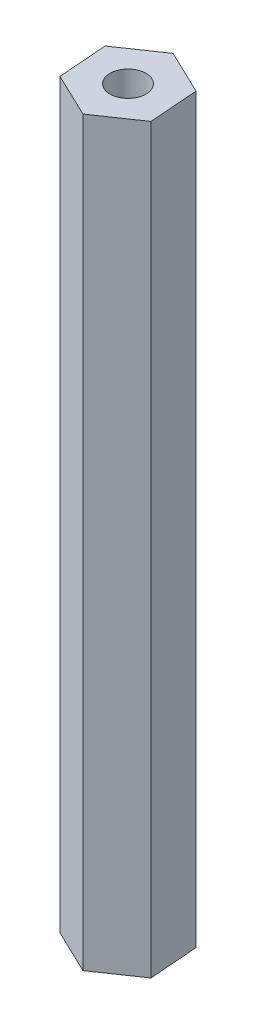
ISO-10303-21;
HEADER;
FILE_DESCRIPTION(('STEP AP214'),'2;1');
FILE_NAME('part.step','',(''),(''),'','','');
FILE_SCHEMA(('AUTOMOTIVE_DESIGN { 1 0 10303 214 1 1 1 1 }'));
ENDSEC;
DATA;
#1=APPLICATION_CONTEXT('core data for automotive mechanical design processes');
#2=APPLICATION_PROTOCOL_DEFINITION('international standard','automotive_design',2000,#1);
#3=PRODUCT_CONTEXT('',#1,'mechanical');
#4=PRODUCT('Part','Part','',(#3));
#5=PRODUCT_RELATED_PRODUCT_CATEGORY('part','',(#4));
#6=PRODUCT_DEFINITION_FORMATION('','',#4);
#7=PRODUCT_DEFINITION_CONTEXT('part definition',#1,'design');
#8=PRODUCT_DEFINITION('design','',#6,#7);
#9=PRODUCT_DEFINITION_SHAPE('','',#8);
#10=(LENGTH_UNIT() NAMED_UNIT(*) SI_UNIT(.MILLI.,.METRE.));
#11=(NAMED_UNIT(*) PLANE_ANGLE_UNIT() SI_UNIT($,.RADIAN.));
#12=(NAMED_UNIT(*) SI_UNIT($,.STERADIAN.) SOLID_ANGLE_UNIT());
#13=UNCERTAINTY_MEASURE_WITH_UNIT(LENGTH_MEASURE(1.E-05),#10,'distance_accuracy_value','');
#14=(GEOMETRIC_REPRESENTATION_CONTEXT(3) GLOBAL_UNCERTAINTY_ASSIGNED_CONTEXT((#13)) GLOBAL_UNIT_ASSIGNED_CONTEXT((#10,
#11,#12)) REPRESENTATION_CONTEXT('',''));
#15=CARTESIAN_POINT('',(0.,0.,0.));
#16=DIRECTION('',(0.,0.,1.));
#17=DIRECTION('',(1.,0.,0.));
#18=AXIS2_PLACEMENT_3D('',#15,#16,#17);
#19=CARTESIAN_POINT('',(4.1881559648035,-1.,-26.3053742712762));
#20=DIRECTION('',(-0.997076466113697,0.,0.0764102134679752));
#21=DIRECTION('',(-0.0764102134679752,0.,-0.997076466113697));
#22=AXIS2_PLACEMENT_3D('',#19,#20,#21);
#23=PLANE('',#22);
#24=DIRECTION('',(-0.0764102134679752,0.,-0.997076466113697));
#25=VECTOR('',#24,1.);
#26=CARTESIAN_POINT('',(4.1881559648035,-71.,-26.3053742712762));
#27=LINE('',#26,#25);
#28=CARTESIAN_POINT('',(4.1881559648035,-71.,-26.3053742712762));
#29=VERTEX_POINT('',#28);
#30=CARTESIAN_POINT('',(3.83523230628693,-71.,-30.9106732001833));
#31=VERTEX_POINT('',#30);
#32=EDGE_CURVE('E133',#29,#31,#27,.T.);
#33=ORIENTED_EDGE('',*,*,#32,.F.);
#34=DIRECTION('',(0.,-1.,0.));
#35=VECTOR('',#34,1.);
#36=CARTESIAN_POINT('',(4.1881559648035,-1.,-26.3053742712762));
#37=LINE('',#36,#35);
#38=CARTESIAN_POINT('',(4.1881559648035,-1.,-26.3053742712762));
#39=VERTEX_POINT('',#38);
#40=EDGE_CURVE('E11',#39,#29,#37,.T.);
#41=ORIENTED_EDGE('',*,*,#40,.F.);
#42=DIRECTION('',(-0.0764102134679752,0.,-0.997076466113697));
#43=VECTOR('',#42,1.);
#44=CARTESIAN_POINT('',(4.1881559648035,-1.,-26.3053742712762));
#45=LINE('',#44,#43);
#46=CARTESIAN_POINT('',(3.83523230628693,-1.,-30.9106732001833));
#47=VERTEX_POINT('',#46);
#48=EDGE_CURVE('E151',#39,#47,#45,.T.);
#49=ORIENTED_EDGE('',*,*,#48,.T.);
#50=DIRECTION('',(0.,-1.,0.));
#51=VECTOR('',#50,1.);
#52=CARTESIAN_POINT('',(3.83523230628693,-1.,-30.9106732001833));
#53=LINE('',#52,#51);
#54=EDGE_CURVE('E45',#47,#31,#53,.T.);
#55=ORIENTED_EDGE('',*,*,#54,.T.);
#56=EDGE_LOOP('',(#33,#41,#49,#55));
#57=FACE_BOUND('',#56,.T.);
#58=ADVANCED_FACE('F42',(#57),#23,.T.);
#59=CARTESIAN_POINT('',(8.35292365851658,-1.,-24.3083656606946));
#60=DIRECTION('',(-0.43236504708499,0.,0.901698655904063));
#61=DIRECTION('',(-0.901698655904063,0.,-0.43236504708499));
#62=AXIS2_PLACEMENT_3D('',#59,#60,#61);
#63=PLANE('',#62);
#64=DIRECTION('',(-0.901698655904063,0.,-0.43236504708499));
#65=VECTOR('',#64,1.);
#66=CARTESIAN_POINT('',(8.35292365851658,-71.,-24.3083656606946));
#67=LINE('',#66,#65);
#68=CARTESIAN_POINT('',(8.35292365851658,-71.,-24.3083656606946));
#69=VERTEX_POINT('',#68);
#70=EDGE_CURVE('E148',#69,#29,#67,.T.);
#71=ORIENTED_EDGE('',*,*,#70,.F.);
#72=DIRECTION('',(0.,-1.,0.));
#73=VECTOR('',#72,1.);
#74=CARTESIAN_POINT('',(8.35292365851658,-1.,-24.3083656606946));
#75=LINE('',#74,#73);
#76=CARTESIAN_POINT('',(8.35292365851658,-1.,-24.3083656606946));
#77=VERTEX_POINT('',#76);
#78=EDGE_CURVE('E51',#77,#69,#75,.T.);
#79=ORIENTED_EDGE('',*,*,#78,.F.);
#80=DIRECTION('',(-0.901698655904063,0.,-0.43236504708499));
#81=VECTOR('',#80,1.);
#82=CARTESIAN_POINT('',(8.35292365851658,-1.,-24.3083656606946));
#83=LINE('',#82,#81);
#84=EDGE_CURVE('E118',#77,#39,#83,.T.);
#85=ORIENTED_EDGE('',*,*,#84,.T.);
#86=ORIENTED_EDGE('',*,*,#40,.T.);
#87=EDGE_LOOP('',(#71,#79,#85,#86));
#88=FACE_BOUND('',#87,.T.);
#89=ADVANCED_FACE('F167',(#88),#63,.T.);
#90=CARTESIAN_POINT('',(12.1647676937131,-1.,-26.91665597902));
#91=DIRECTION('',(0.564711419028707,0.,0.825288442436088));
#92=DIRECTION('',(-0.825288442436088,0.,0.564711419028707));
#93=AXIS2_PLACEMENT_3D('',#90,#91,#92);
#94=PLANE('',#93);
#95=DIRECTION('',(-0.825288442436088,0.,0.564711419028707));
#96=VECTOR('',#95,1.);
#97=CARTESIAN_POINT('',(12.1647676937131,-71.,-26.91665597902));
#98=LINE('',#97,#96);
#99=CARTESIAN_POINT('',(12.1647676937131,-71.,-26.91665597902));
#100=VERTEX_POINT('',#99);
#101=EDGE_CURVE('E104',#100,#69,#98,.T.);
#102=ORIENTED_EDGE('',*,*,#101,.F.);
#103=DIRECTION('',(0.,-1.,0.));
#104=VECTOR('',#103,1.);
#105=CARTESIAN_POINT('',(12.1647676937131,-1.,-26.91665597902));
#106=LINE('',#105,#104);
#107=CARTESIAN_POINT('',(12.1647676937131,-1.,-26.91665597902));
#108=VERTEX_POINT('',#107);
#109=EDGE_CURVE('E99',#108,#100,#106,.T.);
#110=ORIENTED_EDGE('',*,*,#109,.F.);
#111=DIRECTION('',(-0.825288442436088,0.,0.564711419028707));
#112=VECTOR('',#111,1.);
#113=CARTESIAN_POINT('',(12.1647676937131,-1.,-26.91665597902));
#114=LINE('',#113,#112);
#115=EDGE_CURVE('E102',#108,#77,#114,.T.);
#116=ORIENTED_EDGE('',*,*,#115,.T.);
#117=ORIENTED_EDGE('',*,*,#78,.T.);
#118=EDGE_LOOP('',(#102,#110,#116,#117));
#119=FACE_BOUND('',#118,.T.);
#120=ADVANCED_FACE('F101',(#119),#94,.T.);
#121=CARTESIAN_POINT('',(11.8118440351965,-1.,-31.5219549079271));
#122=DIRECTION('',(0.997076466113697,0.,-0.0764102134679748));
#123=DIRECTION('',(0.0764102134679748,0.,0.997076466113697));
#124=AXIS2_PLACEMENT_3D('',#121,#122,#123);
#125=PLANE('',#124);
#126=DIRECTION('',(0.0764102134679747,0.,0.997076466113697));
#127=VECTOR('',#126,1.);
#128=CARTESIAN_POINT('',(11.8118440351965,-71.,-31.5219549079271));
#129=LINE('',#128,#127);
#130=CARTESIAN_POINT('',(11.8118440351965,-71.,-31.5219549079271));
#131=VERTEX_POINT('',#130);
#132=EDGE_CURVE('E144',#131,#100,#129,.T.);
#133=ORIENTED_EDGE('',*,*,#132,.F.);
#134=DIRECTION('',(0.,-1.,0.));
#135=VECTOR('',#134,1.);
#136=CARTESIAN_POINT('',(11.8118440351965,-1.,-31.5219549079271));
#137=LINE('',#136,#135);
#138=CARTESIAN_POINT('',(11.8118440351965,-1.,-31.5219549079271));
#139=VERTEX_POINT('',#138);
#140=EDGE_CURVE('E110',#139,#131,#137,.T.);
#141=ORIENTED_EDGE('',*,*,#140,.F.);
#142=DIRECTION('',(0.0764102134679747,0.,0.997076466113697));
#143=VECTOR('',#142,1.);
#144=CARTESIAN_POINT('',(11.8118440351965,-1.,-31.5219549079271));
#145=LINE('',#144,#143);
#146=EDGE_CURVE('E116',#139,#108,#145,.T.);
#147=ORIENTED_EDGE('',*,*,#146,.T.);
#148=ORIENTED_EDGE('',*,*,#109,.T.);
#149=EDGE_LOOP('',(#133,#141,#147,#148));
#150=FACE_BOUND('',#149,.T.);
#151=ADVANCED_FACE('F121',(#150),#125,.T.);
#152=CARTESIAN_POINT('',(7.64707634148343,-1.,-33.5189635185087));
#153=DIRECTION('',(0.43236504708499,0.,-0.901698655904063));
#154=DIRECTION('',(0.901698655904063,0.,0.43236504708499));
#155=AXIS2_PLACEMENT_3D('',#152,#153,#154);
#156=PLANE('',#155);
#157=DIRECTION('',(0.901698655904063,0.,0.43236504708499));
#158=VECTOR('',#157,1.);
#159=CARTESIAN_POINT('',(7.64707634148343,-71.,-33.5189635185087));
#160=LINE('',#159,#158);
#161=CARTESIAN_POINT('',(7.64707634148343,-71.,-33.5189635185087));
#162=VERTEX_POINT('',#161);
#163=EDGE_CURVE('E141',#162,#131,#160,.T.);
#164=ORIENTED_EDGE('',*,*,#163,.F.);
#165=DIRECTION('',(0.,-1.,0.));
#166=VECTOR('',#165,1.);
#167=CARTESIAN_POINT('',(7.64707634148343,-1.,-33.5189635185087));
#168=LINE('',#167,#166);
#169=CARTESIAN_POINT('',(7.64707634148343,-1.,-33.5189635185087));
#170=VERTEX_POINT('',#169);
#171=EDGE_CURVE('E155',#170,#162,#168,.T.);
#172=ORIENTED_EDGE('',*,*,#171,.F.);
#173=DIRECTION('',(0.901698655904063,0.,0.43236504708499));
#174=VECTOR('',#173,1.);
#175=CARTESIAN_POINT('',(7.64707634148343,-1.,-33.5189635185087));
#176=LINE('',#175,#174);
#177=EDGE_CURVE('E123',#170,#139,#176,.T.);
#178=ORIENTED_EDGE('',*,*,#177,.T.);
#179=ORIENTED_EDGE('',*,*,#140,.T.);
#180=EDGE_LOOP('',(#164,#172,#178,#179));
#181=FACE_BOUND('',#180,.T.);
#182=ADVANCED_FACE('F180',(#181),#156,.T.);
#183=CARTESIAN_POINT('',(3.83523230628693,-1.,-30.9106732001833));
#184=DIRECTION('',(-0.564711419028707,0.,-0.825288442436088));
#185=DIRECTION('',(0.825288442436088,0.,-0.564711419028707));
#186=AXIS2_PLACEMENT_3D('',#183,#184,#185);
#187=PLANE('',#186);
#188=DIRECTION('',(0.825288442436088,0.,-0.564711419028707));
#189=VECTOR('',#188,1.);
#190=CARTESIAN_POINT('',(3.83523230628693,-71.,-30.9106732001833));
#191=LINE('',#190,#189);
#192=EDGE_CURVE('E137',#31,#162,#191,.T.);
#193=ORIENTED_EDGE('',*,*,#192,.F.);
#194=ORIENTED_EDGE('',*,*,#54,.F.);
#195=DIRECTION('',(0.825288442436088,0.,-0.564711419028707));
#196=VECTOR('',#195,1.);
#197=CARTESIAN_POINT('',(3.83523230628693,-1.,-30.9106732001833));
#198=LINE('',#197,#196);
#199=EDGE_CURVE('E128',#47,#170,#198,.T.);
#200=ORIENTED_EDGE('',*,*,#199,.T.);
#201=ORIENTED_EDGE('',*,*,#171,.T.);
#202=EDGE_LOOP('',(#193,#194,#200,#201));
#203=FACE_BOUND('',#202,.T.);
#204=ADVANCED_FACE('F164',(#203),#187,.T.);
#205=CARTESIAN_POINT('',(8.00000000000001,-1.,-28.9136645896017));
#206=DIRECTION('',(0.,-1.,0.));
#207=DIRECTION('',(0.564711419028707,0.,0.825288442436088));
#208=AXIS2_PLACEMENT_3D('',#205,#206,#207);
#209=PLANE('',#208);
#210=CARTESIAN_POINT('',(8.00000000000001,-1.,-28.9136645896017));
#211=DIRECTION('',(0.,-1.,0.));
#212=DIRECTION('',(0.564711419028707,0.,0.825288442436088));
#213=AXIS2_PLACEMENT_3D('',#210,#211,#212);
#214=CIRCLE('',#213,1.7);
#215=CARTESIAN_POINT('',(8.96000941234881,-1.,-27.5106742374603));
#216=VERTEX_POINT('',#215);
#217=EDGE_CURVE('E138',#216,#216,#214,.T.);
#218=ORIENTED_EDGE('',*,*,#217,.T.);
#219=EDGE_LOOP('',(#218));
#220=FACE_BOUND('',#219,.T.);
#221=ORIENTED_EDGE('',*,*,#48,.F.);
#222=ORIENTED_EDGE('',*,*,#84,.F.);
#223=ORIENTED_EDGE('',*,*,#115,.F.);
#224=ORIENTED_EDGE('',*,*,#146,.F.);
#225=ORIENTED_EDGE('',*,*,#177,.F.);
#226=ORIENTED_EDGE('',*,*,#199,.F.);
#227=EDGE_LOOP('',(#221,#222,#223,#224,#225,#226));
#228=FACE_BOUND('',#227,.T.);
#229=ADVANCED_FACE('F114',(#220,#228),#209,.F.);
#230=CARTESIAN_POINT('',(8.00000000000001,-71.,-28.9136645896017));
#231=DIRECTION('',(0.,-1.,0.));
#232=DIRECTION('',(0.564711419028707,0.,0.825288442436088));
#233=AXIS2_PLACEMENT_3D('',#230,#231,#232);
#234=PLANE('',#233);
#235=CARTESIAN_POINT('',(8.00000000000001,-71.,-28.9136645896017));
#236=DIRECTION('',(0.,-1.,0.));
#237=DIRECTION('',(0.564711419028707,0.,0.825288442436088));
#238=AXIS2_PLACEMENT_3D('',#235,#236,#237);
#239=CIRCLE('',#238,1.7);
#240=CARTESIAN_POINT('',(8.96000941234881,-71.,-27.5106742374603));
#241=VERTEX_POINT('',#240);
#242=EDGE_CURVE('E203',#241,#241,#239,.T.);
#243=ORIENTED_EDGE('',*,*,#242,.F.);
#244=EDGE_LOOP('',(#243));
#245=FACE_BOUND('',#244,.T.);
#246=ORIENTED_EDGE('',*,*,#32,.T.);
#247=ORIENTED_EDGE('',*,*,#192,.T.);
#248=ORIENTED_EDGE('',*,*,#163,.T.);
#249=ORIENTED_EDGE('',*,*,#132,.T.);
#250=ORIENTED_EDGE('',*,*,#101,.T.);
#251=ORIENTED_EDGE('',*,*,#70,.T.);
#252=EDGE_LOOP('',(#246,#247,#248,#249,#250,#251));
#253=FACE_BOUND('',#252,.T.);
#254=ADVANCED_FACE('F166',(#245,#253),#234,.T.);
#255=CARTESIAN_POINT('',(8.00000000000001,-1.,-28.9136645896017));
#256=DIRECTION('',(0.,-1.,0.));
#257=DIRECTION('',(0.564711419028707,0.,0.825288442436088));
#258=AXIS2_PLACEMENT_3D('',#255,#256,#257);
#259=CYLINDRICAL_SURFACE('',#258,1.7);
#260=ORIENTED_EDGE('',*,*,#217,.F.);
#261=EDGE_LOOP('',(#260));
#262=FACE_BOUND('',#261,.T.);
#263=ORIENTED_EDGE('',*,*,#242,.T.);
#264=EDGE_LOOP('',(#263));
#265=FACE_BOUND('',#264,.T.);
#266=ADVANCED_FACE('F191',(#262,#265),#259,.F.);
#267=CLOSED_SHELL('',(#58,#89,#120,#151,#182,#204,#229,#254,#266));
#268=MANIFOLD_SOLID_BREP('B2',#267);
#269=ADVANCED_BREP_SHAPE_REPRESENTATION('',(#18,#268),#14);
#270=SHAPE_DEFINITION_REPRESENTATION(#9,#269);
ENDSEC;
END-ISO-10303-21;
